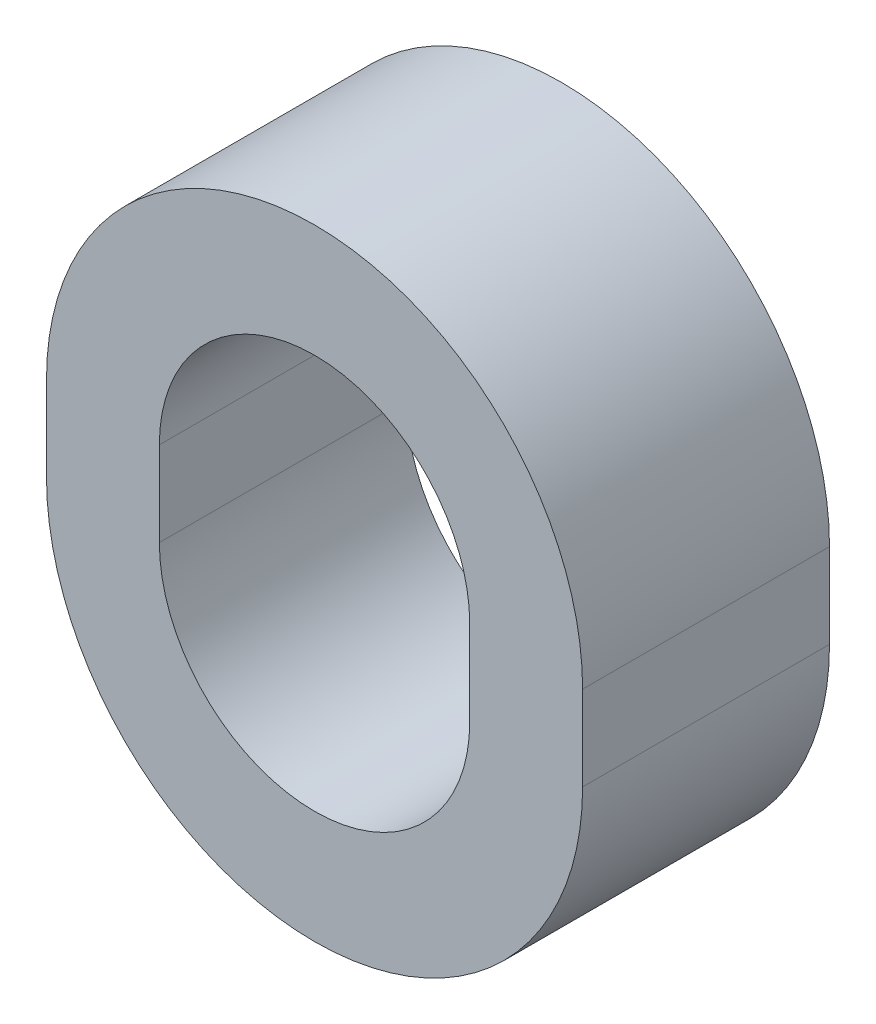
ISO-10303-21;
HEADER;
FILE_DESCRIPTION(('STEP AP214'),'2;1');
FILE_NAME('part.step','',(''),(''),'','','');
FILE_SCHEMA(('AUTOMOTIVE_DESIGN { 1 0 10303 214 1 1 1 1 }'));
ENDSEC;
DATA;
#1=APPLICATION_CONTEXT('core data for automotive mechanical design processes');
#2=APPLICATION_PROTOCOL_DEFINITION('international standard','automotive_design',2000,#1);
#3=PRODUCT_CONTEXT('',#1,'mechanical');
#4=PRODUCT('Part','Part','',(#3));
#5=PRODUCT_RELATED_PRODUCT_CATEGORY('part','',(#4));
#6=PRODUCT_DEFINITION_FORMATION('','',#4);
#7=PRODUCT_DEFINITION_CONTEXT('part definition',#1,'design');
#8=PRODUCT_DEFINITION('design','',#6,#7);
#9=PRODUCT_DEFINITION_SHAPE('','',#8);
#10=(LENGTH_UNIT() NAMED_UNIT(*) SI_UNIT(.MILLI.,.METRE.));
#11=(NAMED_UNIT(*) PLANE_ANGLE_UNIT() SI_UNIT($,.RADIAN.));
#12=(NAMED_UNIT(*) SI_UNIT($,.STERADIAN.) SOLID_ANGLE_UNIT());
#13=UNCERTAINTY_MEASURE_WITH_UNIT(LENGTH_MEASURE(1.E-05),#10,'distance_accuracy_value','');
#14=(GEOMETRIC_REPRESENTATION_CONTEXT(3) GLOBAL_UNCERTAINTY_ASSIGNED_CONTEXT((#13)) GLOBAL_UNIT_ASSIGNED_CONTEXT((#10,
#11,#12)) REPRESENTATION_CONTEXT('',''));
#15=CARTESIAN_POINT('',(0.,0.,0.));
#16=DIRECTION('',(0.,0.,1.));
#17=DIRECTION('',(1.,0.,0.));
#18=AXIS2_PLACEMENT_3D('',#15,#16,#17);
#19=CARTESIAN_POINT('',(0.,-3.,17.5));
#20=DIRECTION('',(0.,0.,-1.));
#21=DIRECTION('',(-1.,0.,0.));
#22=AXIS2_PLACEMENT_3D('',#19,#20,#21);
#23=PLANE('',#22);
#24=CARTESIAN_POINT('',(0.,-3.,17.5));
#25=DIRECTION('',(0.,0.,1.));
#26=DIRECTION('',(-1.,0.,0.));
#27=AXIS2_PLACEMENT_3D('',#24,#25,#26);
#28=CIRCLE('',#27,19.);
#29=CARTESIAN_POINT('',(-19.,-3.,17.5));
#30=VERTEX_POINT('',#29);
#31=CARTESIAN_POINT('',(19.,-3.,17.5));
#32=VERTEX_POINT('',#31);
#33=EDGE_CURVE('E134',#30,#32,#28,.T.);
#34=ORIENTED_EDGE('',*,*,#33,.T.);
#35=DIRECTION('',(0.,1.,0.));
#36=VECTOR('',#35,1.);
#37=CARTESIAN_POINT('',(19.,-3.,17.5));
#38=LINE('',#37,#36);
#39=CARTESIAN_POINT('',(19.,3.,17.5));
#40=VERTEX_POINT('',#39);
#41=EDGE_CURVE('E137',#32,#40,#38,.T.);
#42=ORIENTED_EDGE('',*,*,#41,.T.);
#43=CARTESIAN_POINT('',(0.,3.,17.5));
#44=DIRECTION('',(0.,0.,1.));
#45=DIRECTION('',(1.,0.,0.));
#46=AXIS2_PLACEMENT_3D('',#43,#44,#45);
#47=CIRCLE('',#46,19.);
#48=CARTESIAN_POINT('',(-19.,3.,17.5));
#49=VERTEX_POINT('',#48);
#50=EDGE_CURVE('E140',#40,#49,#47,.T.);
#51=ORIENTED_EDGE('',*,*,#50,.T.);
#52=DIRECTION('',(0.,-1.,0.));
#53=VECTOR('',#52,1.);
#54=CARTESIAN_POINT('',(-19.,-3.,17.5));
#55=LINE('',#54,#53);
#56=EDGE_CURVE('E142',#49,#30,#55,.T.);
#57=ORIENTED_EDGE('',*,*,#56,.T.);
#58=EDGE_LOOP('',(#34,#42,#51,#57));
#59=FACE_BOUND('',#58,.T.);
#60=CARTESIAN_POINT('',(0.,-3.,17.5));
#61=DIRECTION('',(0.,0.,1.));
#62=DIRECTION('',(-1.,0.,0.));
#63=AXIS2_PLACEMENT_3D('',#60,#61,#62);
#64=CIRCLE('',#63,11.);
#65=CARTESIAN_POINT('',(-11.,-3.,17.5));
#66=VERTEX_POINT('',#65);
#67=CARTESIAN_POINT('',(11.,-3.,17.5));
#68=VERTEX_POINT('',#67);
#69=EDGE_CURVE('E98',#66,#68,#64,.T.);
#70=ORIENTED_EDGE('',*,*,#69,.F.);
#71=DIRECTION('',(0.,-1.,0.));
#72=VECTOR('',#71,1.);
#73=CARTESIAN_POINT('',(-11.,-3.,17.5));
#74=LINE('',#73,#72);
#75=CARTESIAN_POINT('',(-11.,3.,17.5));
#76=VERTEX_POINT('',#75);
#77=EDGE_CURVE('E120',#76,#66,#74,.T.);
#78=ORIENTED_EDGE('',*,*,#77,.F.);
#79=CARTESIAN_POINT('',(0.,3.,17.5));
#80=DIRECTION('',(0.,0.,1.));
#81=DIRECTION('',(1.,0.,0.));
#82=AXIS2_PLACEMENT_3D('',#79,#80,#81);
#83=CIRCLE('',#82,11.);
#84=CARTESIAN_POINT('',(11.,3.,17.5));
#85=VERTEX_POINT('',#84);
#86=EDGE_CURVE('E118',#85,#76,#83,.T.);
#87=ORIENTED_EDGE('',*,*,#86,.F.);
#88=DIRECTION('',(0.,1.,0.));
#89=VECTOR('',#88,1.);
#90=CARTESIAN_POINT('',(11.,-3.,17.5));
#91=LINE('',#90,#89);
#92=EDGE_CURVE('E106',#68,#85,#91,.T.);
#93=ORIENTED_EDGE('',*,*,#92,.F.);
#94=EDGE_LOOP('',(#70,#78,#87,#93));
#95=FACE_BOUND('',#94,.T.);
#96=ADVANCED_FACE('F33',(#59,#95),#23,.F.);
#97=CARTESIAN_POINT('',(0.,-3.,0.));
#98=DIRECTION('',(0.,0.,-1.));
#99=DIRECTION('',(-1.,0.,0.));
#100=AXIS2_PLACEMENT_3D('',#97,#98,#99);
#101=PLANE('',#100);
#102=CARTESIAN_POINT('',(0.,-3.,0.));
#103=DIRECTION('',(0.,0.,1.));
#104=DIRECTION('',(-1.,0.,0.));
#105=AXIS2_PLACEMENT_3D('',#102,#103,#104);
#106=CIRCLE('',#105,19.);
#107=CARTESIAN_POINT('',(-19.,-3.,0.));
#108=VERTEX_POINT('',#107);
#109=CARTESIAN_POINT('',(19.,-3.,0.));
#110=VERTEX_POINT('',#109);
#111=EDGE_CURVE('E114',#108,#110,#106,.T.);
#112=ORIENTED_EDGE('',*,*,#111,.F.);
#113=DIRECTION('',(0.,-1.,0.));
#114=VECTOR('',#113,1.);
#115=CARTESIAN_POINT('',(-19.,-3.,0.));
#116=LINE('',#115,#114);
#117=CARTESIAN_POINT('',(-19.,3.,0.));
#118=VERTEX_POINT('',#117);
#119=EDGE_CURVE('E138',#118,#108,#116,.T.);
#120=ORIENTED_EDGE('',*,*,#119,.F.);
#121=CARTESIAN_POINT('',(0.,3.,0.));
#122=DIRECTION('',(0.,0.,1.));
#123=DIRECTION('',(1.,0.,0.));
#124=AXIS2_PLACEMENT_3D('',#121,#122,#123);
#125=CIRCLE('',#124,19.);
#126=CARTESIAN_POINT('',(19.,3.,0.));
#127=VERTEX_POINT('',#126);
#128=EDGE_CURVE('E149',#127,#118,#125,.T.);
#129=ORIENTED_EDGE('',*,*,#128,.F.);
#130=DIRECTION('',(0.,1.,0.));
#131=VECTOR('',#130,1.);
#132=CARTESIAN_POINT('',(19.,-3.,0.));
#133=LINE('',#132,#131);
#134=EDGE_CURVE('E147',#110,#127,#133,.T.);
#135=ORIENTED_EDGE('',*,*,#134,.F.);
#136=EDGE_LOOP('',(#112,#120,#129,#135));
#137=FACE_BOUND('',#136,.T.);
#138=DIRECTION('',(0.,-1.,0.));
#139=VECTOR('',#138,1.);
#140=CARTESIAN_POINT('',(-11.,-3.,0.));
#141=LINE('',#140,#139);
#142=CARTESIAN_POINT('',(-11.,3.,0.));
#143=VERTEX_POINT('',#142);
#144=CARTESIAN_POINT('',(-11.,-3.,0.));
#145=VERTEX_POINT('',#144);
#146=EDGE_CURVE('E107',#143,#145,#141,.T.);
#147=ORIENTED_EDGE('',*,*,#146,.T.);
#148=CARTESIAN_POINT('',(0.,-3.,0.));
#149=DIRECTION('',(0.,0.,1.));
#150=DIRECTION('',(-1.,0.,0.));
#151=AXIS2_PLACEMENT_3D('',#148,#149,#150);
#152=CIRCLE('',#151,11.);
#153=CARTESIAN_POINT('',(11.,-3.,0.));
#154=VERTEX_POINT('',#153);
#155=EDGE_CURVE('E56',#145,#154,#152,.T.);
#156=ORIENTED_EDGE('',*,*,#155,.T.);
#157=DIRECTION('',(0.,1.,0.));
#158=VECTOR('',#157,1.);
#159=CARTESIAN_POINT('',(11.,-3.,0.));
#160=LINE('',#159,#158);
#161=CARTESIAN_POINT('',(11.,3.,0.));
#162=VERTEX_POINT('',#161);
#163=EDGE_CURVE('E113',#154,#162,#160,.T.);
#164=ORIENTED_EDGE('',*,*,#163,.T.);
#165=CARTESIAN_POINT('',(0.,3.,0.));
#166=DIRECTION('',(0.,0.,1.));
#167=DIRECTION('',(1.,0.,0.));
#168=AXIS2_PLACEMENT_3D('',#165,#166,#167);
#169=CIRCLE('',#168,11.);
#170=EDGE_CURVE('E126',#162,#143,#169,.T.);
#171=ORIENTED_EDGE('',*,*,#170,.T.);
#172=EDGE_LOOP('',(#147,#156,#164,#171));
#173=FACE_BOUND('',#172,.T.);
#174=ADVANCED_FACE('F167',(#137,#173),#101,.T.);
#175=CARTESIAN_POINT('',(0.,-3.,17.5));
#176=DIRECTION('',(0.,0.,-1.));
#177=DIRECTION('',(-1.,0.,0.));
#178=AXIS2_PLACEMENT_3D('',#175,#176,#177);
#179=CYLINDRICAL_SURFACE('',#178,19.);
#180=ORIENTED_EDGE('',*,*,#111,.T.);
#181=DIRECTION('',(0.,0.,-1.));
#182=VECTOR('',#181,1.);
#183=CARTESIAN_POINT('',(19.,-3.,17.5));
#184=LINE('',#183,#182);
#185=EDGE_CURVE('E11',#32,#110,#184,.T.);
#186=ORIENTED_EDGE('',*,*,#185,.F.);
#187=ORIENTED_EDGE('',*,*,#33,.F.);
#188=DIRECTION('',(0.,0.,-1.));
#189=VECTOR('',#188,1.);
#190=CARTESIAN_POINT('',(-19.,-3.,17.5));
#191=LINE('',#190,#189);
#192=EDGE_CURVE('E144',#30,#108,#191,.T.);
#193=ORIENTED_EDGE('',*,*,#192,.T.);
#194=EDGE_LOOP('',(#180,#186,#187,#193));
#195=FACE_BOUND('',#194,.T.);
#196=ADVANCED_FACE('F35',(#195),#179,.T.);
#197=CARTESIAN_POINT('',(19.,-3.,17.5));
#198=DIRECTION('',(-1.,0.,0.));
#199=DIRECTION('',(0.,0.,1.));
#200=AXIS2_PLACEMENT_3D('',#197,#198,#199);
#201=PLANE('',#200);
#202=ORIENTED_EDGE('',*,*,#134,.T.);
#203=DIRECTION('',(0.,0.,-1.));
#204=VECTOR('',#203,1.);
#205=CARTESIAN_POINT('',(19.,3.,17.5));
#206=LINE('',#205,#204);
#207=EDGE_CURVE('E41',#40,#127,#206,.T.);
#208=ORIENTED_EDGE('',*,*,#207,.F.);
#209=ORIENTED_EDGE('',*,*,#41,.F.);
#210=ORIENTED_EDGE('',*,*,#185,.T.);
#211=EDGE_LOOP('',(#202,#208,#209,#210));
#212=FACE_BOUND('',#211,.T.);
#213=ADVANCED_FACE('F177',(#212),#201,.F.);
#214=CARTESIAN_POINT('',(0.,3.,17.5));
#215=DIRECTION('',(0.,0.,-1.));
#216=DIRECTION('',(-1.,0.,0.));
#217=AXIS2_PLACEMENT_3D('',#214,#215,#216);
#218=CYLINDRICAL_SURFACE('',#217,19.);
#219=ORIENTED_EDGE('',*,*,#128,.T.);
#220=DIRECTION('',(0.,0.,-1.));
#221=VECTOR('',#220,1.);
#222=CARTESIAN_POINT('',(-19.,3.,17.5));
#223=LINE('',#222,#221);
#224=EDGE_CURVE('E154',#49,#118,#223,.T.);
#225=ORIENTED_EDGE('',*,*,#224,.F.);
#226=ORIENTED_EDGE('',*,*,#50,.F.);
#227=ORIENTED_EDGE('',*,*,#207,.T.);
#228=EDGE_LOOP('',(#219,#225,#226,#227));
#229=FACE_BOUND('',#228,.T.);
#230=ADVANCED_FACE('F161',(#229),#218,.T.);
#231=CARTESIAN_POINT('',(-19.,-3.,17.5));
#232=DIRECTION('',(1.,0.,0.));
#233=DIRECTION('',(0.,0.,-1.));
#234=AXIS2_PLACEMENT_3D('',#231,#232,#233);
#235=PLANE('',#234);
#236=ORIENTED_EDGE('',*,*,#119,.T.);
#237=ORIENTED_EDGE('',*,*,#192,.F.);
#238=ORIENTED_EDGE('',*,*,#56,.F.);
#239=ORIENTED_EDGE('',*,*,#224,.T.);
#240=EDGE_LOOP('',(#236,#237,#238,#239));
#241=FACE_BOUND('',#240,.T.);
#242=ADVANCED_FACE('F171',(#241),#235,.F.);
#243=CARTESIAN_POINT('',(0.,-3.,17.5));
#244=DIRECTION('',(0.,0.,-1.));
#245=DIRECTION('',(-1.,0.,0.));
#246=AXIS2_PLACEMENT_3D('',#243,#244,#245);
#247=CYLINDRICAL_SURFACE('',#246,11.);
#248=ORIENTED_EDGE('',*,*,#155,.F.);
#249=DIRECTION('',(0.,0.,-1.));
#250=VECTOR('',#249,1.);
#251=CARTESIAN_POINT('',(-11.,-3.,17.5));
#252=LINE('',#251,#250);
#253=EDGE_CURVE('E102',#66,#145,#252,.T.);
#254=ORIENTED_EDGE('',*,*,#253,.F.);
#255=ORIENTED_EDGE('',*,*,#69,.T.);
#256=DIRECTION('',(0.,0.,-1.));
#257=VECTOR('',#256,1.);
#258=CARTESIAN_POINT('',(11.,-3.,17.5));
#259=LINE('',#258,#257);
#260=EDGE_CURVE('E101',#68,#154,#259,.T.);
#261=ORIENTED_EDGE('',*,*,#260,.T.);
#262=EDGE_LOOP('',(#248,#254,#255,#261));
#263=FACE_BOUND('',#262,.T.);
#264=ADVANCED_FACE('F100',(#263),#247,.F.);
#265=CARTESIAN_POINT('',(11.,-3.,17.5));
#266=DIRECTION('',(-1.,0.,0.));
#267=DIRECTION('',(0.,0.,1.));
#268=AXIS2_PLACEMENT_3D('',#265,#266,#267);
#269=PLANE('',#268);
#270=ORIENTED_EDGE('',*,*,#163,.F.);
#271=ORIENTED_EDGE('',*,*,#260,.F.);
#272=ORIENTED_EDGE('',*,*,#92,.T.);
#273=DIRECTION('',(0.,0.,-1.));
#274=VECTOR('',#273,1.);
#275=CARTESIAN_POINT('',(11.,3.,17.5));
#276=LINE('',#275,#274);
#277=EDGE_CURVE('E115',#85,#162,#276,.T.);
#278=ORIENTED_EDGE('',*,*,#277,.T.);
#279=EDGE_LOOP('',(#270,#271,#272,#278));
#280=FACE_BOUND('',#279,.T.);
#281=ADVANCED_FACE('F110',(#280),#269,.T.);
#282=CARTESIAN_POINT('',(0.,3.,17.5));
#283=DIRECTION('',(0.,0.,-1.));
#284=DIRECTION('',(-1.,0.,0.));
#285=AXIS2_PLACEMENT_3D('',#282,#283,#284);
#286=CYLINDRICAL_SURFACE('',#285,11.);
#287=ORIENTED_EDGE('',*,*,#170,.F.);
#288=ORIENTED_EDGE('',*,*,#277,.F.);
#289=ORIENTED_EDGE('',*,*,#86,.T.);
#290=DIRECTION('',(0.,0.,-1.));
#291=VECTOR('',#290,1.);
#292=CARTESIAN_POINT('',(-11.,3.,17.5));
#293=LINE('',#292,#291);
#294=EDGE_CURVE('E48',#76,#143,#293,.T.);
#295=ORIENTED_EDGE('',*,*,#294,.T.);
#296=EDGE_LOOP('',(#287,#288,#289,#295));
#297=FACE_BOUND('',#296,.T.);
#298=ADVANCED_FACE('F200',(#297),#286,.F.);
#299=CARTESIAN_POINT('',(-11.,-3.,17.5));
#300=DIRECTION('',(1.,0.,0.));
#301=DIRECTION('',(0.,0.,-1.));
#302=AXIS2_PLACEMENT_3D('',#299,#300,#301);
#303=PLANE('',#302);
#304=ORIENTED_EDGE('',*,*,#146,.F.);
#305=ORIENTED_EDGE('',*,*,#294,.F.);
#306=ORIENTED_EDGE('',*,*,#77,.T.);
#307=ORIENTED_EDGE('',*,*,#253,.T.);
#308=EDGE_LOOP('',(#304,#305,#306,#307));
#309=FACE_BOUND('',#308,.T.);
#310=ADVANCED_FACE('F204',(#309),#303,.T.);
#311=CLOSED_SHELL('',(#96,#174,#196,#213,#230,#242,#264,#281,#298,#310));
#312=MANIFOLD_SOLID_BREP('B2',#311);
#313=ADVANCED_BREP_SHAPE_REPRESENTATION('',(#18,#312),#14);
#314=SHAPE_DEFINITION_REPRESENTATION(#9,#313);
ENDSEC;
END-ISO-10303-21;
